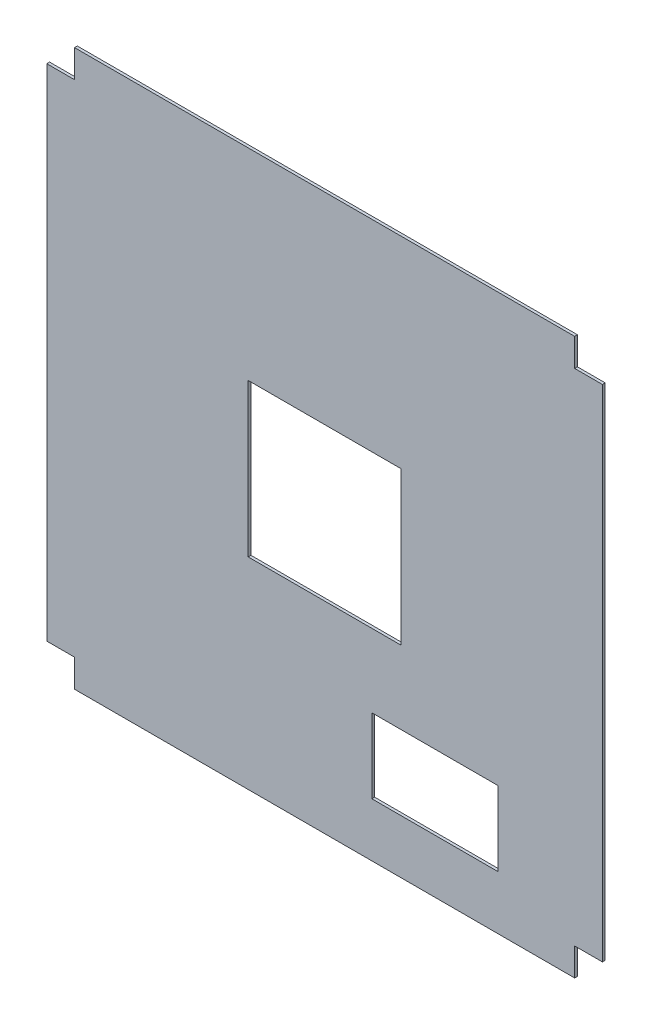
ISO-10303-21;
HEADER;
FILE_DESCRIPTION(('STEP AP214'),'2;1');
FILE_NAME('part.step','',(''),(''),'','','');
FILE_SCHEMA(('AUTOMOTIVE_DESIGN { 1 0 10303 214 1 1 1 1 }'));
ENDSEC;
DATA;
#1=APPLICATION_CONTEXT('core data for automotive mechanical design processes');
#2=APPLICATION_PROTOCOL_DEFINITION('international standard','automotive_design',2000,#1);
#3=PRODUCT_CONTEXT('',#1,'mechanical');
#4=PRODUCT('Part','Part','',(#3));
#5=PRODUCT_RELATED_PRODUCT_CATEGORY('part','',(#4));
#6=PRODUCT_DEFINITION_FORMATION('','',#4);
#7=PRODUCT_DEFINITION_CONTEXT('part definition',#1,'design');
#8=PRODUCT_DEFINITION('design','',#6,#7);
#9=PRODUCT_DEFINITION_SHAPE('','',#8);
#10=(LENGTH_UNIT() NAMED_UNIT(*) SI_UNIT(.MILLI.,.METRE.));
#11=(NAMED_UNIT(*) PLANE_ANGLE_UNIT() SI_UNIT($,.RADIAN.));
#12=(NAMED_UNIT(*) SI_UNIT($,.STERADIAN.) SOLID_ANGLE_UNIT());
#13=UNCERTAINTY_MEASURE_WITH_UNIT(LENGTH_MEASURE(1.E-05),#10,'distance_accuracy_value','');
#14=(GEOMETRIC_REPRESENTATION_CONTEXT(3) GLOBAL_UNCERTAINTY_ASSIGNED_CONTEXT((#13)) GLOBAL_UNIT_ASSIGNED_CONTEXT((#10,
#11,#12)) REPRESENTATION_CONTEXT('',''));
#15=CARTESIAN_POINT('',(0.,0.,0.));
#16=DIRECTION('',(0.,0.,1.));
#17=DIRECTION('',(1.,0.,0.));
#18=AXIS2_PLACEMENT_3D('',#15,#16,#17);
#19=CARTESIAN_POINT('',(370.000000000875,380.,2.));
#20=DIRECTION('',(-1.,0.,0.));
#21=DIRECTION('',(0.,-1.,0.));
#22=AXIS2_PLACEMENT_3D('',#19,#20,#21);
#23=PLANE('',#22);
#24=DIRECTION('',(0.,1.,0.));
#25=VECTOR('',#24,1.);
#26=CARTESIAN_POINT('',(370.000000000875,380.,0.));
#27=LINE('',#26,#25);
#28=CARTESIAN_POINT('',(370.000000000875,360.000000000017,0.));
#29=VERTEX_POINT('',#28);
#30=CARTESIAN_POINT('',(370.000000000875,380.,0.));
#31=VERTEX_POINT('',#30);
#32=EDGE_CURVE('E227',#29,#31,#27,.T.);
#33=ORIENTED_EDGE('',*,*,#32,.T.);
#34=DIRECTION('',(0.,0.,-1.));
#35=VECTOR('',#34,1.);
#36=CARTESIAN_POINT('',(370.000000000875,380.,2.));
#37=LINE('',#36,#35);
#38=CARTESIAN_POINT('',(370.000000000875,380.,2.));
#39=VERTEX_POINT('',#38);
#40=EDGE_CURVE('E316',#39,#31,#37,.T.);
#41=ORIENTED_EDGE('',*,*,#40,.F.);
#42=DIRECTION('',(0.,1.,0.));
#43=VECTOR('',#42,1.);
#44=CARTESIAN_POINT('',(370.000000000875,380.,2.));
#45=LINE('',#44,#43);
#46=CARTESIAN_POINT('',(370.000000000875,360.000000000017,2.));
#47=VERTEX_POINT('',#46);
#48=EDGE_CURVE('E234',#47,#39,#45,.T.);
#49=ORIENTED_EDGE('',*,*,#48,.F.);
#50=DIRECTION('',(0.,0.,-1.));
#51=VECTOR('',#50,1.);
#52=CARTESIAN_POINT('',(370.000000000875,360.000000000017,2.));
#53=LINE('',#52,#51);
#54=EDGE_CURVE('E260',#47,#29,#53,.T.);
#55=ORIENTED_EDGE('',*,*,#54,.T.);
#56=EDGE_LOOP('',(#33,#41,#49,#55));
#57=FACE_BOUND('',#56,.T.);
#58=ADVANCED_FACE('F38',(#57),#23,.F.);
#59=CARTESIAN_POINT('',(10.0000000008793,380.,2.));
#60=DIRECTION('',(0.,-1.,0.));
#61=DIRECTION('',(0.,0.,-1.));
#62=AXIS2_PLACEMENT_3D('',#59,#60,#61);
#63=PLANE('',#62);
#64=DIRECTION('',(-1.,0.,0.));
#65=VECTOR('',#64,1.);
#66=CARTESIAN_POINT('',(10.0000000008793,380.,0.));
#67=LINE('',#66,#65);
#68=CARTESIAN_POINT('',(10.0000000008793,380.,0.));
#69=VERTEX_POINT('',#68);
#70=EDGE_CURVE('E263',#31,#69,#67,.T.);
#71=ORIENTED_EDGE('',*,*,#70,.T.);
#72=DIRECTION('',(0.,0.,-1.));
#73=VECTOR('',#72,1.);
#74=CARTESIAN_POINT('',(10.0000000008793,380.,2.));
#75=LINE('',#74,#73);
#76=CARTESIAN_POINT('',(10.0000000008793,380.,2.));
#77=VERTEX_POINT('',#76);
#78=EDGE_CURVE('E313',#77,#69,#75,.T.);
#79=ORIENTED_EDGE('',*,*,#78,.F.);
#80=DIRECTION('',(-1.,0.,0.));
#81=VECTOR('',#80,1.);
#82=CARTESIAN_POINT('',(10.0000000008793,380.,2.));
#83=LINE('',#82,#81);
#84=EDGE_CURVE('E237',#39,#77,#83,.T.);
#85=ORIENTED_EDGE('',*,*,#84,.F.);
#86=ORIENTED_EDGE('',*,*,#40,.T.);
#87=EDGE_LOOP('',(#71,#79,#85,#86));
#88=FACE_BOUND('',#87,.T.);
#89=ADVANCED_FACE('F344',(#88),#63,.F.);
#90=CARTESIAN_POINT('',(10.0000000008793,380.,2.));
#91=DIRECTION('',(1.,0.,0.));
#92=DIRECTION('',(0.,0.,-1.));
#93=AXIS2_PLACEMENT_3D('',#90,#91,#92);
#94=PLANE('',#93);
#95=DIRECTION('',(0.,-1.,0.));
#96=VECTOR('',#95,1.);
#97=CARTESIAN_POINT('',(10.0000000008793,380.,0.));
#98=LINE('',#97,#96);
#99=CARTESIAN_POINT('',(10.0000000008793,359.999999999983,0.));
#100=VERTEX_POINT('',#99);
#101=EDGE_CURVE('E265',#69,#100,#98,.T.);
#102=ORIENTED_EDGE('',*,*,#101,.T.);
#103=DIRECTION('',(0.,0.,-1.));
#104=VECTOR('',#103,1.);
#105=CARTESIAN_POINT('',(10.0000000008793,359.999999999983,2.));
#106=LINE('',#105,#104);
#107=CARTESIAN_POINT('',(10.0000000008793,359.999999999983,2.));
#108=VERTEX_POINT('',#107);
#109=EDGE_CURVE('E310',#108,#100,#106,.T.);
#110=ORIENTED_EDGE('',*,*,#109,.F.);
#111=DIRECTION('',(0.,-1.,0.));
#112=VECTOR('',#111,1.);
#113=CARTESIAN_POINT('',(10.0000000008793,380.,2.));
#114=LINE('',#113,#112);
#115=EDGE_CURVE('E240',#77,#108,#114,.T.);
#116=ORIENTED_EDGE('',*,*,#115,.F.);
#117=ORIENTED_EDGE('',*,*,#78,.T.);
#118=EDGE_LOOP('',(#102,#110,#116,#117));
#119=FACE_BOUND('',#118,.T.);
#120=ADVANCED_FACE('F349',(#119),#94,.F.);
#121=CARTESIAN_POINT('',(-9.99999999910343,359.999999999983,2.));
#122=DIRECTION('',(0.,-1.,0.));
#123=DIRECTION('',(0.,0.,-1.));
#124=AXIS2_PLACEMENT_3D('',#121,#122,#123);
#125=PLANE('',#124);
#126=DIRECTION('',(-1.,0.,0.));
#127=VECTOR('',#126,1.);
#128=CARTESIAN_POINT('',(-9.99999999910343,359.999999999983,0.));
#129=LINE('',#128,#127);
#130=CARTESIAN_POINT('',(-9.99999999910343,359.999999999983,0.));
#131=VERTEX_POINT('',#130);
#132=EDGE_CURVE('E267',#100,#131,#129,.T.);
#133=ORIENTED_EDGE('',*,*,#132,.T.);
#134=DIRECTION('',(0.,0.,-1.));
#135=VECTOR('',#134,1.);
#136=CARTESIAN_POINT('',(-9.99999999910343,359.999999999983,2.));
#137=LINE('',#136,#135);
#138=CARTESIAN_POINT('',(-9.99999999910343,359.999999999983,2.));
#139=VERTEX_POINT('',#138);
#140=EDGE_CURVE('E307',#139,#131,#137,.T.);
#141=ORIENTED_EDGE('',*,*,#140,.F.);
#142=DIRECTION('',(-1.,0.,0.));
#143=VECTOR('',#142,1.);
#144=CARTESIAN_POINT('',(-9.99999999910343,359.999999999983,2.));
#145=LINE('',#144,#143);
#146=EDGE_CURVE('E242',#108,#139,#145,.T.);
#147=ORIENTED_EDGE('',*,*,#146,.F.);
#148=ORIENTED_EDGE('',*,*,#109,.T.);
#149=EDGE_LOOP('',(#133,#141,#147,#148));
#150=FACE_BOUND('',#149,.T.);
#151=ADVANCED_FACE('F402',(#150),#125,.F.);
#152=CARTESIAN_POINT('',(-9.99999999910343,359.999999999983,2.));
#153=DIRECTION('',(1.,0.,0.));
#154=DIRECTION('',(0.,0.,-1.));
#155=AXIS2_PLACEMENT_3D('',#152,#153,#154);
#156=PLANE('',#155);
#157=DIRECTION('',(0.,-1.,0.));
#158=VECTOR('',#157,1.);
#159=CARTESIAN_POINT('',(-9.99999999910343,359.999999999983,0.));
#160=LINE('',#159,#158);
#161=CARTESIAN_POINT('',(-9.99999999910343,-1.33736804320796E-11,0.));
#162=VERTEX_POINT('',#161);
#163=EDGE_CURVE('E269',#131,#162,#160,.T.);
#164=ORIENTED_EDGE('',*,*,#163,.T.);
#165=DIRECTION('',(0.,0.,-1.));
#166=VECTOR('',#165,1.);
#167=CARTESIAN_POINT('',(-9.99999999910343,-1.33736804320796E-11,2.));
#168=LINE('',#167,#166);
#169=CARTESIAN_POINT('',(-9.99999999910343,-1.33736804320796E-11,2.));
#170=VERTEX_POINT('',#169);
#171=EDGE_CURVE('E304',#170,#162,#168,.T.);
#172=ORIENTED_EDGE('',*,*,#171,.F.);
#173=DIRECTION('',(0.,-1.,0.));
#174=VECTOR('',#173,1.);
#175=CARTESIAN_POINT('',(-9.99999999910343,359.999999999983,2.));
#176=LINE('',#175,#174);
#177=EDGE_CURVE('E244',#139,#170,#176,.T.);
#178=ORIENTED_EDGE('',*,*,#177,.F.);
#179=ORIENTED_EDGE('',*,*,#140,.T.);
#180=EDGE_LOOP('',(#164,#172,#178,#179));
#181=FACE_BOUND('',#180,.T.);
#182=ADVANCED_FACE('F399',(#181),#156,.F.);
#183=CARTESIAN_POINT('',(-9.99999999910343,-1.33736804320796E-11,2.));
#184=DIRECTION('',(0.,1.,0.));
#185=DIRECTION('',(-1.,0.,0.));
#186=AXIS2_PLACEMENT_3D('',#183,#184,#185);
#187=PLANE('',#186);
#188=DIRECTION('',(1.,0.,0.));
#189=VECTOR('',#188,1.);
#190=CARTESIAN_POINT('',(-9.99999999910343,-1.33736804320796E-11,0.));
#191=LINE('',#190,#189);
#192=CARTESIAN_POINT('',(10.0000000009138,-1.33781874467331E-11,0.));
#193=VERTEX_POINT('',#192);
#194=EDGE_CURVE('E271',#162,#193,#191,.T.);
#195=ORIENTED_EDGE('',*,*,#194,.T.);
#196=DIRECTION('',(0.,0.,-1.));
#197=VECTOR('',#196,1.);
#198=CARTESIAN_POINT('',(10.0000000009138,-1.33781874467331E-11,2.));
#199=LINE('',#198,#197);
#200=CARTESIAN_POINT('',(10.0000000009138,-1.33781874467331E-11,2.));
#201=VERTEX_POINT('',#200);
#202=EDGE_CURVE('E301',#201,#193,#199,.T.);
#203=ORIENTED_EDGE('',*,*,#202,.F.);
#204=DIRECTION('',(1.,0.,0.));
#205=VECTOR('',#204,1.);
#206=CARTESIAN_POINT('',(-9.99999999910343,-1.33736804320796E-11,2.));
#207=LINE('',#206,#205);
#208=EDGE_CURVE('E246',#170,#201,#207,.T.);
#209=ORIENTED_EDGE('',*,*,#208,.F.);
#210=ORIENTED_EDGE('',*,*,#171,.T.);
#211=EDGE_LOOP('',(#195,#203,#209,#210));
#212=FACE_BOUND('',#211,.T.);
#213=ADVANCED_FACE('F395',(#212),#187,.F.);
#214=CARTESIAN_POINT('',(10.0000000009138,-19.9999999999961,2.));
#215=DIRECTION('',(1.,0.,0.));
#216=DIRECTION('',(0.,1.,0.));
#217=AXIS2_PLACEMENT_3D('',#214,#215,#216);
#218=PLANE('',#217);
#219=DIRECTION('',(0.,-1.,0.));
#220=VECTOR('',#219,1.);
#221=CARTESIAN_POINT('',(10.0000000009138,-19.9999999999961,0.));
#222=LINE('',#221,#220);
#223=CARTESIAN_POINT('',(10.0000000009138,-19.9999999999961,0.));
#224=VERTEX_POINT('',#223);
#225=EDGE_CURVE('E273',#193,#224,#222,.T.);
#226=ORIENTED_EDGE('',*,*,#225,.T.);
#227=DIRECTION('',(0.,0.,-1.));
#228=VECTOR('',#227,1.);
#229=CARTESIAN_POINT('',(10.0000000009138,-19.9999999999961,2.));
#230=LINE('',#229,#228);
#231=CARTESIAN_POINT('',(10.0000000009138,-19.9999999999961,2.));
#232=VERTEX_POINT('',#231);
#233=EDGE_CURVE('E298',#232,#224,#230,.T.);
#234=ORIENTED_EDGE('',*,*,#233,.F.);
#235=DIRECTION('',(0.,-1.,0.));
#236=VECTOR('',#235,1.);
#237=CARTESIAN_POINT('',(10.0000000009138,-19.9999999999961,2.));
#238=LINE('',#237,#236);
#239=EDGE_CURVE('E248',#201,#232,#238,.T.);
#240=ORIENTED_EDGE('',*,*,#239,.F.);
#241=ORIENTED_EDGE('',*,*,#202,.T.);
#242=EDGE_LOOP('',(#226,#234,#240,#241));
#243=FACE_BOUND('',#242,.T.);
#244=ADVANCED_FACE('F390',(#243),#218,.F.);
#245=CARTESIAN_POINT('',(10.0000000009138,-19.9999999999961,2.));
#246=DIRECTION('',(0.,1.,0.));
#247=DIRECTION('',(-1.,0.,0.));
#248=AXIS2_PLACEMENT_3D('',#245,#246,#247);
#249=PLANE('',#248);
#250=DIRECTION('',(1.,0.,0.));
#251=VECTOR('',#250,1.);
#252=CARTESIAN_POINT('',(10.0000000009138,-19.9999999999961,0.));
#253=LINE('',#252,#251);
#254=CARTESIAN_POINT('',(370.00000000091,-19.9999999999961,0.));
#255=VERTEX_POINT('',#254);
#256=EDGE_CURVE('E275',#224,#255,#253,.T.);
#257=ORIENTED_EDGE('',*,*,#256,.T.);
#258=DIRECTION('',(0.,0.,-1.));
#259=VECTOR('',#258,1.);
#260=CARTESIAN_POINT('',(370.00000000091,-19.9999999999961,2.));
#261=LINE('',#260,#259);
#262=CARTESIAN_POINT('',(370.00000000091,-19.9999999999961,2.));
#263=VERTEX_POINT('',#262);
#264=EDGE_CURVE('E295',#263,#255,#261,.T.);
#265=ORIENTED_EDGE('',*,*,#264,.F.);
#266=DIRECTION('',(1.,0.,0.));
#267=VECTOR('',#266,1.);
#268=CARTESIAN_POINT('',(10.0000000009138,-19.9999999999961,2.));
#269=LINE('',#268,#267);
#270=EDGE_CURVE('E250',#232,#263,#269,.T.);
#271=ORIENTED_EDGE('',*,*,#270,.F.);
#272=ORIENTED_EDGE('',*,*,#233,.T.);
#273=EDGE_LOOP('',(#257,#265,#271,#272));
#274=FACE_BOUND('',#273,.T.);
#275=ADVANCED_FACE('F384',(#274),#249,.F.);
#276=CARTESIAN_POINT('',(370.00000000091,-19.9999999999961,2.));
#277=DIRECTION('',(-1.,0.,0.));
#278=DIRECTION('',(0.,-1.,0.));
#279=AXIS2_PLACEMENT_3D('',#276,#277,#278);
#280=PLANE('',#279);
#281=DIRECTION('',(0.,1.,0.));
#282=VECTOR('',#281,1.);
#283=CARTESIAN_POINT('',(370.00000000091,-19.9999999999961,0.));
#284=LINE('',#283,#282);
#285=CARTESIAN_POINT('',(370.00000000091,2.1094237467878E-11,0.));
#286=VERTEX_POINT('',#285);
#287=EDGE_CURVE('E277',#255,#286,#284,.T.);
#288=ORIENTED_EDGE('',*,*,#287,.T.);
#289=DIRECTION('',(0.,0.,-1.));
#290=VECTOR('',#289,1.);
#291=CARTESIAN_POINT('',(370.00000000091,2.1094237467878E-11,2.));
#292=LINE('',#291,#290);
#293=CARTESIAN_POINT('',(370.00000000091,2.1094237467878E-11,2.));
#294=VERTEX_POINT('',#293);
#295=EDGE_CURVE('E292',#294,#286,#292,.T.);
#296=ORIENTED_EDGE('',*,*,#295,.F.);
#297=DIRECTION('',(0.,1.,0.));
#298=VECTOR('',#297,1.);
#299=CARTESIAN_POINT('',(370.00000000091,-19.9999999999961,2.));
#300=LINE('',#299,#298);
#301=EDGE_CURVE('E252',#263,#294,#300,.T.);
#302=ORIENTED_EDGE('',*,*,#301,.F.);
#303=ORIENTED_EDGE('',*,*,#264,.T.);
#304=EDGE_LOOP('',(#288,#296,#302,#303));
#305=FACE_BOUND('',#304,.T.);
#306=ADVANCED_FACE('F380',(#305),#280,.F.);
#307=CARTESIAN_POINT('',(390.000000000892,2.10387263166467E-11,2.));
#308=DIRECTION('',(0.,1.,0.));
#309=DIRECTION('',(-1.,0.,0.));
#310=AXIS2_PLACEMENT_3D('',#307,#308,#309);
#311=PLANE('',#310);
#312=DIRECTION('',(1.,0.,0.));
#313=VECTOR('',#312,1.);
#314=CARTESIAN_POINT('',(390.000000000892,2.10387263166467E-11,0.));
#315=LINE('',#314,#313);
#316=CARTESIAN_POINT('',(390.000000000892,2.10387263166467E-11,0.));
#317=VERTEX_POINT('',#316);
#318=EDGE_CURVE('E279',#286,#317,#315,.T.);
#319=ORIENTED_EDGE('',*,*,#318,.T.);
#320=DIRECTION('',(0.,0.,-1.));
#321=VECTOR('',#320,1.);
#322=CARTESIAN_POINT('',(390.000000000892,2.10387263166467E-11,2.));
#323=LINE('',#322,#321);
#324=CARTESIAN_POINT('',(390.000000000892,2.10387263166467E-11,2.));
#325=VERTEX_POINT('',#324);
#326=EDGE_CURVE('E289',#325,#317,#323,.T.);
#327=ORIENTED_EDGE('',*,*,#326,.F.);
#328=DIRECTION('',(1.,0.,0.));
#329=VECTOR('',#328,1.);
#330=CARTESIAN_POINT('',(390.000000000892,2.10387263166467E-11,2.));
#331=LINE('',#330,#329);
#332=EDGE_CURVE('E254',#294,#325,#331,.T.);
#333=ORIENTED_EDGE('',*,*,#332,.F.);
#334=ORIENTED_EDGE('',*,*,#295,.T.);
#335=EDGE_LOOP('',(#319,#327,#333,#334));
#336=FACE_BOUND('',#335,.T.);
#337=ADVANCED_FACE('F375',(#336),#311,.F.);
#338=CARTESIAN_POINT('',(390.000000000892,360.000000000017,2.));
#339=DIRECTION('',(-1.,0.,0.));
#340=DIRECTION('',(0.,-1.,0.));
#341=AXIS2_PLACEMENT_3D('',#338,#339,#340);
#342=PLANE('',#341);
#343=DIRECTION('',(0.,1.,0.));
#344=VECTOR('',#343,1.);
#345=CARTESIAN_POINT('',(390.000000000892,360.000000000017,0.));
#346=LINE('',#345,#344);
#347=CARTESIAN_POINT('',(390.000000000892,360.000000000017,0.));
#348=VERTEX_POINT('',#347);
#349=EDGE_CURVE('E281',#317,#348,#346,.T.);
#350=ORIENTED_EDGE('',*,*,#349,.T.);
#351=DIRECTION('',(0.,0.,-1.));
#352=VECTOR('',#351,1.);
#353=CARTESIAN_POINT('',(390.000000000892,360.000000000017,2.));
#354=LINE('',#353,#352);
#355=CARTESIAN_POINT('',(390.000000000892,360.000000000017,2.));
#356=VERTEX_POINT('',#355);
#357=EDGE_CURVE('E286',#356,#348,#354,.T.);
#358=ORIENTED_EDGE('',*,*,#357,.F.);
#359=DIRECTION('',(0.,1.,0.));
#360=VECTOR('',#359,1.);
#361=CARTESIAN_POINT('',(390.000000000892,360.000000000017,2.));
#362=LINE('',#361,#360);
#363=EDGE_CURVE('E256',#325,#356,#362,.T.);
#364=ORIENTED_EDGE('',*,*,#363,.F.);
#365=ORIENTED_EDGE('',*,*,#326,.T.);
#366=EDGE_LOOP('',(#350,#358,#364,#365));
#367=FACE_BOUND('',#366,.T.);
#368=ADVANCED_FACE('F369',(#367),#342,.F.);
#369=CARTESIAN_POINT('',(390.000000000892,360.000000000017,2.));
#370=DIRECTION('',(0.,-1.,0.));
#371=DIRECTION('',(1.,0.,0.));
#372=AXIS2_PLACEMENT_3D('',#369,#370,#371);
#373=PLANE('',#372);
#374=DIRECTION('',(-1.,0.,0.));
#375=VECTOR('',#374,1.);
#376=CARTESIAN_POINT('',(390.000000000892,360.000000000017,0.));
#377=LINE('',#376,#375);
#378=EDGE_CURVE('E238',#348,#29,#377,.T.);
#379=ORIENTED_EDGE('',*,*,#378,.T.);
#380=ORIENTED_EDGE('',*,*,#54,.F.);
#381=DIRECTION('',(-1.,0.,0.));
#382=VECTOR('',#381,1.);
#383=CARTESIAN_POINT('',(390.000000000892,360.000000000017,2.));
#384=LINE('',#383,#382);
#385=EDGE_CURVE('E258',#356,#47,#384,.T.);
#386=ORIENTED_EDGE('',*,*,#385,.F.);
#387=ORIENTED_EDGE('',*,*,#357,.T.);
#388=EDGE_LOOP('',(#379,#380,#386,#387));
#389=FACE_BOUND('',#388,.T.);
#390=ADVANCED_FACE('F367',(#389),#373,.F.);
#391=CARTESIAN_POINT('',(0.,0.,2.));
#392=DIRECTION('',(0.,0.,-1.));
#393=DIRECTION('',(-1.,0.,0.));
#394=AXIS2_PLACEMENT_3D('',#391,#392,#393);
#395=PLANE('',#394);
#396=DIRECTION('',(-1.,0.,0.));
#397=VECTOR('',#396,1.);
#398=CARTESIAN_POINT('',(224.025946889718,72.3541204204289,2.));
#399=LINE('',#398,#397);
#400=CARTESIAN_POINT('',(314.761805464838,72.3541204204289,2.));
#401=VERTEX_POINT('',#400);
#402=CARTESIAN_POINT('',(224.025946889718,72.3541204204289,2.));
#403=VERTEX_POINT('',#402);
#404=EDGE_CURVE('E185',#401,#403,#399,.T.);
#405=ORIENTED_EDGE('',*,*,#404,.F.);
#406=DIRECTION('',(0.,1.,0.));
#407=VECTOR('',#406,1.);
#408=CARTESIAN_POINT('',(314.761805464838,18.73747671695,2.));
#409=LINE('',#408,#407);
#410=CARTESIAN_POINT('',(314.761805464838,18.73747671695,2.));
#411=VERTEX_POINT('',#410);
#412=EDGE_CURVE('E52',#411,#401,#409,.T.);
#413=ORIENTED_EDGE('',*,*,#412,.F.);
#414=DIRECTION('',(1.,0.,0.));
#415=VECTOR('',#414,1.);
#416=CARTESIAN_POINT('',(224.025946889718,18.73747671695,2.));
#417=LINE('',#416,#415);
#418=CARTESIAN_POINT('',(224.025946889718,18.73747671695,2.));
#419=VERTEX_POINT('',#418);
#420=EDGE_CURVE('E192',#419,#411,#417,.T.);
#421=ORIENTED_EDGE('',*,*,#420,.F.);
#422=DIRECTION('',(0.,-1.,0.));
#423=VECTOR('',#422,1.);
#424=CARTESIAN_POINT('',(224.025946889718,18.73747671695,2.));
#425=LINE('',#424,#423);
#426=EDGE_CURVE('E176',#403,#419,#425,.T.);
#427=ORIENTED_EDGE('',*,*,#426,.F.);
#428=EDGE_LOOP('',(#405,#413,#421,#427));
#429=FACE_BOUND('',#428,.T.);
#430=DIRECTION('',(-1.,0.,0.));
#431=VECTOR('',#430,1.);
#432=CARTESIAN_POINT('',(134.999999924042,235.000000000002,2.));
#433=LINE('',#432,#431);
#434=CARTESIAN_POINT('',(244.999999924042,235.000000000002,2.));
#435=VERTEX_POINT('',#434);
#436=CARTESIAN_POINT('',(134.999999924042,235.000000000002,2.));
#437=VERTEX_POINT('',#436);
#438=EDGE_CURVE('E217',#435,#437,#433,.T.);
#439=ORIENTED_EDGE('',*,*,#438,.F.);
#440=DIRECTION('',(0.,1.,0.));
#441=VECTOR('',#440,1.);
#442=CARTESIAN_POINT('',(244.999999924042,125.000000000002,2.));
#443=LINE('',#442,#441);
#444=CARTESIAN_POINT('',(244.999999924042,125.000000000002,2.));
#445=VERTEX_POINT('',#444);
#446=EDGE_CURVE('E199',#445,#435,#443,.T.);
#447=ORIENTED_EDGE('',*,*,#446,.F.);
#448=DIRECTION('',(1.,0.,0.));
#449=VECTOR('',#448,1.);
#450=CARTESIAN_POINT('',(134.999999924042,125.000000000002,2.));
#451=LINE('',#450,#449);
#452=CARTESIAN_POINT('',(134.999999924042,125.000000000002,2.));
#453=VERTEX_POINT('',#452);
#454=EDGE_CURVE('E206',#453,#445,#451,.T.);
#455=ORIENTED_EDGE('',*,*,#454,.F.);
#456=DIRECTION('',(0.,-1.,0.));
#457=VECTOR('',#456,1.);
#458=CARTESIAN_POINT('',(134.999999924042,125.000000000002,2.));
#459=LINE('',#458,#457);
#460=EDGE_CURVE('E220',#437,#453,#459,.T.);
#461=ORIENTED_EDGE('',*,*,#460,.F.);
#462=EDGE_LOOP('',(#439,#447,#455,#461));
#463=FACE_BOUND('',#462,.T.);
#464=ORIENTED_EDGE('',*,*,#48,.T.);
#465=ORIENTED_EDGE('',*,*,#84,.T.);
#466=ORIENTED_EDGE('',*,*,#115,.T.);
#467=ORIENTED_EDGE('',*,*,#146,.T.);
#468=ORIENTED_EDGE('',*,*,#177,.T.);
#469=ORIENTED_EDGE('',*,*,#208,.T.);
#470=ORIENTED_EDGE('',*,*,#239,.T.);
#471=ORIENTED_EDGE('',*,*,#270,.T.);
#472=ORIENTED_EDGE('',*,*,#301,.T.);
#473=ORIENTED_EDGE('',*,*,#332,.T.);
#474=ORIENTED_EDGE('',*,*,#363,.T.);
#475=ORIENTED_EDGE('',*,*,#385,.T.);
#476=EDGE_LOOP('',(#464,#465,#466,#467,#468,#469,#470,#471,#472,#473,#474,#475));
#477=FACE_BOUND('',#476,.T.);
#478=ADVANCED_FACE('F189',(#429,#463,#477),#395,.F.);
#479=CARTESIAN_POINT('',(0.,0.,0.));
#480=DIRECTION('',(0.,0.,-1.));
#481=DIRECTION('',(-1.,0.,0.));
#482=AXIS2_PLACEMENT_3D('',#479,#480,#481);
#483=PLANE('',#482);
#484=DIRECTION('',(0.,-1.,0.));
#485=VECTOR('',#484,1.);
#486=CARTESIAN_POINT('',(314.761805464838,0.,0.));
#487=LINE('',#486,#485);
#488=CARTESIAN_POINT('',(314.761805464838,72.3541204204289,0.));
#489=VERTEX_POINT('',#488);
#490=CARTESIAN_POINT('',(314.761805464838,18.73747671695,0.));
#491=VERTEX_POINT('',#490);
#492=EDGE_CURVE('E11',#489,#491,#487,.T.);
#493=ORIENTED_EDGE('',*,*,#492,.F.);
#494=DIRECTION('',(1.,0.,0.));
#495=VECTOR('',#494,1.);
#496=CARTESIAN_POINT('',(0.,72.3541204204289,0.));
#497=LINE('',#496,#495);
#498=CARTESIAN_POINT('',(224.025946889718,72.3541204204289,0.));
#499=VERTEX_POINT('',#498);
#500=EDGE_CURVE('E319',#499,#489,#497,.T.);
#501=ORIENTED_EDGE('',*,*,#500,.F.);
#502=DIRECTION('',(0.,1.,0.));
#503=VECTOR('',#502,1.);
#504=CARTESIAN_POINT('',(224.025946889718,0.,0.));
#505=LINE('',#504,#503);
#506=CARTESIAN_POINT('',(224.025946889718,18.73747671695,0.));
#507=VERTEX_POINT('',#506);
#508=EDGE_CURVE('E179',#507,#499,#505,.T.);
#509=ORIENTED_EDGE('',*,*,#508,.F.);
#510=DIRECTION('',(-1.,0.,0.));
#511=VECTOR('',#510,1.);
#512=CARTESIAN_POINT('',(0.,18.73747671695,0.));
#513=LINE('',#512,#511);
#514=EDGE_CURVE('E45',#491,#507,#513,.T.);
#515=ORIENTED_EDGE('',*,*,#514,.F.);
#516=EDGE_LOOP('',(#493,#501,#509,#515));
#517=FACE_BOUND('',#516,.T.);
#518=DIRECTION('',(0.,1.,0.));
#519=VECTOR('',#518,1.);
#520=CARTESIAN_POINT('',(244.999999924042,125.000000000002,0.));
#521=LINE('',#520,#519);
#522=CARTESIAN_POINT('',(244.999999924042,125.000000000002,0.));
#523=VERTEX_POINT('',#522);
#524=CARTESIAN_POINT('',(244.999999924042,235.000000000002,0.));
#525=VERTEX_POINT('',#524);
#526=EDGE_CURVE('E202',#523,#525,#521,.T.);
#527=ORIENTED_EDGE('',*,*,#526,.T.);
#528=DIRECTION('',(-1.,0.,0.));
#529=VECTOR('',#528,1.);
#530=CARTESIAN_POINT('',(134.999999924042,235.000000000002,0.));
#531=LINE('',#530,#529);
#532=CARTESIAN_POINT('',(134.999999924042,235.000000000002,0.));
#533=VERTEX_POINT('',#532);
#534=EDGE_CURVE('E205',#525,#533,#531,.T.);
#535=ORIENTED_EDGE('',*,*,#534,.T.);
#536=DIRECTION('',(0.,-1.,0.));
#537=VECTOR('',#536,1.);
#538=CARTESIAN_POINT('',(134.999999924042,125.000000000002,0.));
#539=LINE('',#538,#537);
#540=CARTESIAN_POINT('',(134.999999924042,125.000000000002,0.));
#541=VERTEX_POINT('',#540);
#542=EDGE_CURVE('E209',#533,#541,#539,.T.);
#543=ORIENTED_EDGE('',*,*,#542,.T.);
#544=DIRECTION('',(1.,0.,0.));
#545=VECTOR('',#544,1.);
#546=CARTESIAN_POINT('',(134.999999924042,125.000000000002,0.));
#547=LINE('',#546,#545);
#548=EDGE_CURVE('E212',#541,#523,#547,.T.);
#549=ORIENTED_EDGE('',*,*,#548,.T.);
#550=EDGE_LOOP('',(#527,#535,#543,#549));
#551=FACE_BOUND('',#550,.T.);
#552=ORIENTED_EDGE('',*,*,#32,.F.);
#553=ORIENTED_EDGE('',*,*,#378,.F.);
#554=ORIENTED_EDGE('',*,*,#349,.F.);
#555=ORIENTED_EDGE('',*,*,#318,.F.);
#556=ORIENTED_EDGE('',*,*,#287,.F.);
#557=ORIENTED_EDGE('',*,*,#256,.F.);
#558=ORIENTED_EDGE('',*,*,#225,.F.);
#559=ORIENTED_EDGE('',*,*,#194,.F.);
#560=ORIENTED_EDGE('',*,*,#163,.F.);
#561=ORIENTED_EDGE('',*,*,#132,.F.);
#562=ORIENTED_EDGE('',*,*,#101,.F.);
#563=ORIENTED_EDGE('',*,*,#70,.F.);
#564=EDGE_LOOP('',(#552,#553,#554,#555,#556,#557,#558,#559,#560,#561,#562,#563));
#565=FACE_BOUND('',#564,.T.);
#566=ADVANCED_FACE('F327',(#517,#551,#565),#483,.T.);
#567=CARTESIAN_POINT('',(244.999999924042,125.000000000002,0.));
#568=DIRECTION('',(1.,0.,0.));
#569=DIRECTION('',(0.,0.,-1.));
#570=AXIS2_PLACEMENT_3D('',#567,#568,#569);
#571=PLANE('',#570);
#572=ORIENTED_EDGE('',*,*,#446,.T.);
#573=DIRECTION('',(0.,0.,1.));
#574=VECTOR('',#573,1.);
#575=CARTESIAN_POINT('',(244.999999924042,235.000000000002,0.));
#576=LINE('',#575,#574);
#577=EDGE_CURVE('E215',#525,#435,#576,.T.);
#578=ORIENTED_EDGE('',*,*,#577,.F.);
#579=ORIENTED_EDGE('',*,*,#526,.F.);
#580=DIRECTION('',(0.,0.,1.));
#581=VECTOR('',#580,1.);
#582=CARTESIAN_POINT('',(244.999999924042,125.000000000002,0.));
#583=LINE('',#582,#581);
#584=EDGE_CURVE('E225',#523,#445,#583,.T.);
#585=ORIENTED_EDGE('',*,*,#584,.T.);
#586=EDGE_LOOP('',(#572,#578,#579,#585));
#587=FACE_BOUND('',#586,.T.);
#588=ADVANCED_FACE('F431',(#587),#571,.F.);
#589=CARTESIAN_POINT('',(134.999999924042,125.000000000002,0.));
#590=DIRECTION('',(0.,-1.,0.));
#591=DIRECTION('',(0.,0.,-1.));
#592=AXIS2_PLACEMENT_3D('',#589,#590,#591);
#593=PLANE('',#592);
#594=ORIENTED_EDGE('',*,*,#454,.T.);
#595=ORIENTED_EDGE('',*,*,#584,.F.);
#596=ORIENTED_EDGE('',*,*,#548,.F.);
#597=DIRECTION('',(0.,0.,1.));
#598=VECTOR('',#597,1.);
#599=CARTESIAN_POINT('',(134.999999924042,125.000000000002,0.));
#600=LINE('',#599,#598);
#601=EDGE_CURVE('E228',#541,#453,#600,.T.);
#602=ORIENTED_EDGE('',*,*,#601,.T.);
#603=EDGE_LOOP('',(#594,#595,#596,#602));
#604=FACE_BOUND('',#603,.T.);
#605=ADVANCED_FACE('F435',(#604),#593,.F.);
#606=CARTESIAN_POINT('',(134.999999924042,125.000000000002,0.));
#607=DIRECTION('',(-1.,0.,0.));
#608=DIRECTION('',(0.,0.,1.));
#609=AXIS2_PLACEMENT_3D('',#606,#607,#608);
#610=PLANE('',#609);
#611=ORIENTED_EDGE('',*,*,#460,.T.);
#612=ORIENTED_EDGE('',*,*,#601,.F.);
#613=ORIENTED_EDGE('',*,*,#542,.F.);
#614=DIRECTION('',(0.,0.,1.));
#615=VECTOR('',#614,1.);
#616=CARTESIAN_POINT('',(134.999999924042,235.000000000002,0.));
#617=LINE('',#616,#615);
#618=EDGE_CURVE('E230',#533,#437,#617,.T.);
#619=ORIENTED_EDGE('',*,*,#618,.T.);
#620=EDGE_LOOP('',(#611,#612,#613,#619));
#621=FACE_BOUND('',#620,.T.);
#622=ADVANCED_FACE('F338',(#621),#610,.F.);
#623=CARTESIAN_POINT('',(134.999999924042,235.000000000002,0.));
#624=DIRECTION('',(0.,1.,0.));
#625=DIRECTION('',(-1.,0.,0.));
#626=AXIS2_PLACEMENT_3D('',#623,#624,#625);
#627=PLANE('',#626);
#628=ORIENTED_EDGE('',*,*,#438,.T.);
#629=ORIENTED_EDGE('',*,*,#618,.F.);
#630=ORIENTED_EDGE('',*,*,#534,.F.);
#631=ORIENTED_EDGE('',*,*,#577,.T.);
#632=EDGE_LOOP('',(#628,#629,#630,#631));
#633=FACE_BOUND('',#632,.T.);
#634=ADVANCED_FACE('F331',(#633),#627,.F.);
#635=CARTESIAN_POINT('',(314.761805464838,18.73747671695,-73.));
#636=DIRECTION('',(1.,0.,0.));
#637=DIRECTION('',(0.,0.,-1.));
#638=AXIS2_PLACEMENT_3D('',#635,#636,#637);
#639=PLANE('',#638);
#640=ORIENTED_EDGE('',*,*,#492,.T.);
#641=DIRECTION('',(0.,0.,1.));
#642=VECTOR('',#641,1.);
#643=CARTESIAN_POINT('',(314.761805464838,18.73747671695,-73.));
#644=LINE('',#643,#642);
#645=EDGE_CURVE('E197',#491,#411,#644,.T.);
#646=ORIENTED_EDGE('',*,*,#645,.T.);
#647=ORIENTED_EDGE('',*,*,#412,.T.);
#648=DIRECTION('',(0.,0.,1.));
#649=VECTOR('',#648,1.);
#650=CARTESIAN_POINT('',(314.761805464838,72.3541204204289,-73.));
#651=LINE('',#650,#649);
#652=EDGE_CURVE('E182',#489,#401,#651,.T.);
#653=ORIENTED_EDGE('',*,*,#652,.F.);
#654=EDGE_LOOP('',(#640,#646,#647,#653));
#655=FACE_BOUND('',#654,.T.);
#656=ADVANCED_FACE('F329',(#655),#639,.F.);
#657=CARTESIAN_POINT('',(224.025946889718,18.73747671695,-73.));
#658=DIRECTION('',(0.,-1.,0.));
#659=DIRECTION('',(0.,0.,-1.));
#660=AXIS2_PLACEMENT_3D('',#657,#658,#659);
#661=PLANE('',#660);
#662=ORIENTED_EDGE('',*,*,#514,.T.);
#663=DIRECTION('',(0.,0.,1.));
#664=VECTOR('',#663,1.);
#665=CARTESIAN_POINT('',(224.025946889718,18.73747671695,-73.));
#666=LINE('',#665,#664);
#667=EDGE_CURVE('E181',#507,#419,#666,.T.);
#668=ORIENTED_EDGE('',*,*,#667,.T.);
#669=ORIENTED_EDGE('',*,*,#420,.T.);
#670=ORIENTED_EDGE('',*,*,#645,.F.);
#671=EDGE_LOOP('',(#662,#668,#669,#670));
#672=FACE_BOUND('',#671,.T.);
#673=ADVANCED_FACE('F324',(#672),#661,.F.);
#674=CARTESIAN_POINT('',(224.025946889718,18.73747671695,-73.));
#675=DIRECTION('',(-1.,0.,0.));
#676=DIRECTION('',(0.,0.,1.));
#677=AXIS2_PLACEMENT_3D('',#674,#675,#676);
#678=PLANE('',#677);
#679=ORIENTED_EDGE('',*,*,#508,.T.);
#680=DIRECTION('',(0.,0.,1.));
#681=VECTOR('',#680,1.);
#682=CARTESIAN_POINT('',(224.025946889718,72.3541204204289,-73.));
#683=LINE('',#682,#681);
#684=EDGE_CURVE('E60',#499,#403,#683,.T.);
#685=ORIENTED_EDGE('',*,*,#684,.T.);
#686=ORIENTED_EDGE('',*,*,#426,.T.);
#687=ORIENTED_EDGE('',*,*,#667,.F.);
#688=EDGE_LOOP('',(#679,#685,#686,#687));
#689=FACE_BOUND('',#688,.T.);
#690=ADVANCED_FACE('F173',(#689),#678,.F.);
#691=CARTESIAN_POINT('',(224.025946889718,72.3541204204289,-73.));
#692=DIRECTION('',(0.,1.,0.));
#693=DIRECTION('',(0.,0.,1.));
#694=AXIS2_PLACEMENT_3D('',#691,#692,#693);
#695=PLANE('',#694);
#696=ORIENTED_EDGE('',*,*,#500,.T.);
#697=ORIENTED_EDGE('',*,*,#652,.T.);
#698=ORIENTED_EDGE('',*,*,#404,.T.);
#699=ORIENTED_EDGE('',*,*,#684,.F.);
#700=EDGE_LOOP('',(#696,#697,#698,#699));
#701=FACE_BOUND('',#700,.T.);
#702=ADVANCED_FACE('F186',(#701),#695,.F.);
#703=CLOSED_SHELL('',(#58,#89,#120,#151,#182,#213,#244,#275,#306,#337,#368,#390,#478,#566,#588,
#605,#622,#634,#656,#673,#690,#702));
#704=MANIFOLD_SOLID_BREP('B2',#703);
#705=ADVANCED_BREP_SHAPE_REPRESENTATION('',(#18,#704),#14);
#706=SHAPE_DEFINITION_REPRESENTATION(#9,#705);
ENDSEC;
END-ISO-10303-21;
